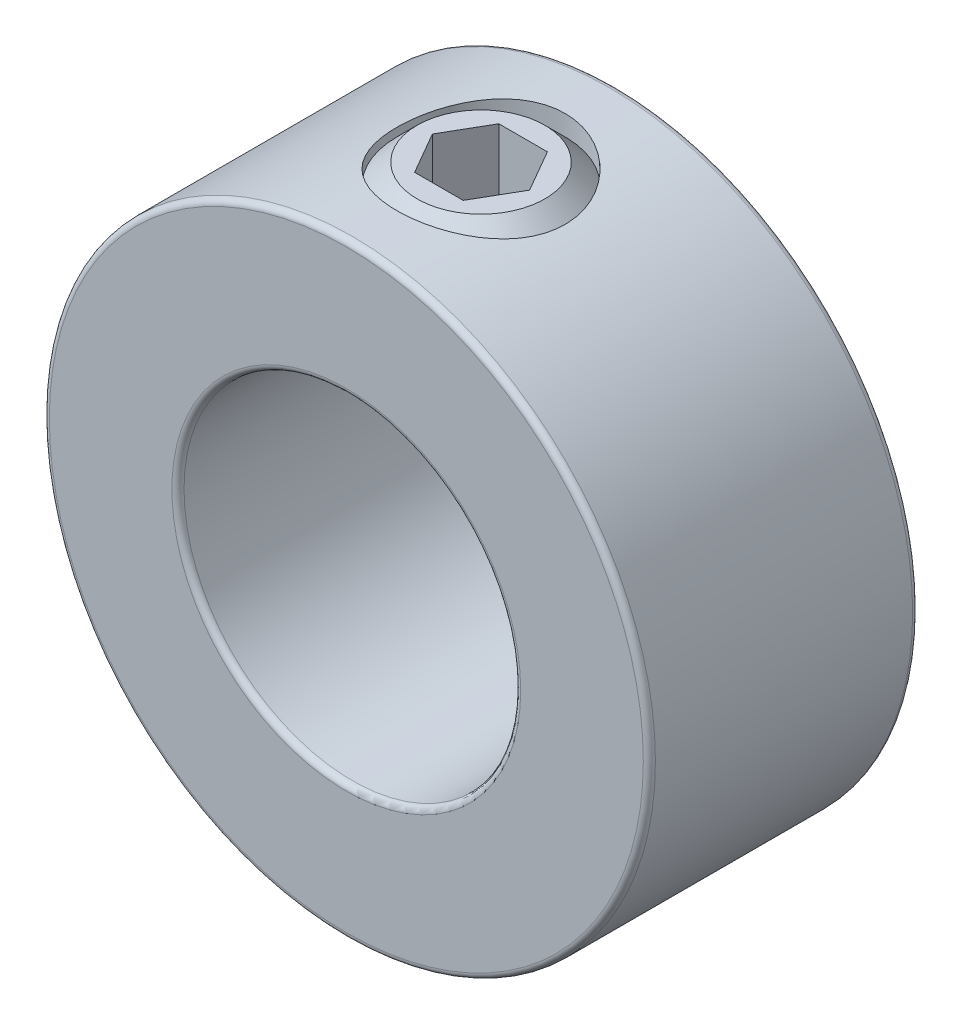
ISO-10303-21;
HEADER;
FILE_DESCRIPTION(('STEP AP214'),'2;1');
FILE_NAME('part.step','',(''),(''),'','','');
FILE_SCHEMA(('AUTOMOTIVE_DESIGN { 1 0 10303 214 1 1 1 1 }'));
ENDSEC;
DATA;
#1=APPLICATION_CONTEXT('core data for automotive mechanical design processes');
#2=APPLICATION_PROTOCOL_DEFINITION('international standard','automotive_design',2000,#1);
#3=PRODUCT_CONTEXT('',#1,'mechanical');
#4=PRODUCT('Part','Part','',(#3));
#5=PRODUCT_RELATED_PRODUCT_CATEGORY('part','',(#4));
#6=PRODUCT_DEFINITION_FORMATION('','',#4);
#7=PRODUCT_DEFINITION_CONTEXT('part definition',#1,'design');
#8=PRODUCT_DEFINITION('design','',#6,#7);
#9=PRODUCT_DEFINITION_SHAPE('','',#8);
#10=(LENGTH_UNIT() NAMED_UNIT(*) SI_UNIT(.MILLI.,.METRE.));
#11=(NAMED_UNIT(*) PLANE_ANGLE_UNIT() SI_UNIT($,.RADIAN.));
#12=(NAMED_UNIT(*) SI_UNIT($,.STERADIAN.) SOLID_ANGLE_UNIT());
#13=UNCERTAINTY_MEASURE_WITH_UNIT(LENGTH_MEASURE(1.E-05),#10,'distance_accuracy_value','');
#14=(GEOMETRIC_REPRESENTATION_CONTEXT(3) GLOBAL_UNCERTAINTY_ASSIGNED_CONTEXT((#13)) GLOBAL_UNIT_ASSIGNED_CONTEXT((#10,
#11,#12)) REPRESENTATION_CONTEXT('',''));
#15=CARTESIAN_POINT('',(0.,0.,0.));
#16=DIRECTION('',(0.,0.,1.));
#17=DIRECTION('',(1.,0.,0.));
#18=AXIS2_PLACEMENT_3D('',#15,#16,#17);
#19=CARTESIAN_POINT('',(0.,14.2875,0.));
#20=DIRECTION('',(0.,1.,0.));
#21=DIRECTION('',(-1.,0.,0.));
#22=AXIS2_PLACEMENT_3D('',#19,#20,#21);
#23=PLANE('',#22);
#24=CARTESIAN_POINT('',(0.,14.2875,0.));
#25=DIRECTION('',(0.,1.,0.));
#26=DIRECTION('',(-1.,0.,0.));
#27=AXIS2_PLACEMENT_3D('',#24,#25,#26);
#28=CIRCLE('',#27,3.01024078905505);
#29=CARTESIAN_POINT('',(-3.01024078905505,14.2875,0.));
#30=VERTEX_POINT('',#29);
#31=EDGE_CURVE('E115',#30,#30,#28,.T.);
#32=ORIENTED_EDGE('',*,*,#31,.T.);
#33=EDGE_LOOP('',(#32));
#34=FACE_BOUND('',#33,.T.);
#35=DIRECTION('',(1.,0.,0.));
#36=VECTOR('',#35,1.);
#37=CARTESIAN_POINT('',(-1.14567944042316,14.2875,-1.984375));
#38=LINE('',#37,#36);
#39=CARTESIAN_POINT('',(-1.14567944042316,14.2875,-1.984375));
#40=VERTEX_POINT('',#39);
#41=CARTESIAN_POINT('',(1.14567944042316,14.2875,-1.984375));
#42=VERTEX_POINT('',#41);
#43=EDGE_CURVE('E110',#40,#42,#38,.T.);
#44=ORIENTED_EDGE('',*,*,#43,.T.);
#45=DIRECTION('',(0.5,0.,0.866025403784439));
#46=VECTOR('',#45,1.);
#47=CARTESIAN_POINT('',(1.14567944042316,14.2875,-1.984375));
#48=LINE('',#47,#46);
#49=CARTESIAN_POINT('',(2.29135888084633,14.2875,0.));
#50=VERTEX_POINT('',#49);
#51=EDGE_CURVE('E56',#42,#50,#48,.T.);
#52=ORIENTED_EDGE('',*,*,#51,.T.);
#53=DIRECTION('',(-0.5,0.,0.866025403784439));
#54=VECTOR('',#53,1.);
#55=CARTESIAN_POINT('',(2.29135888084633,14.2875,0.));
#56=LINE('',#55,#54);
#57=CARTESIAN_POINT('',(1.14567944042317,14.2875,1.984375));
#58=VERTEX_POINT('',#57);
#59=EDGE_CURVE('E114',#50,#58,#56,.T.);
#60=ORIENTED_EDGE('',*,*,#59,.T.);
#61=DIRECTION('',(-1.,0.,0.));
#62=VECTOR('',#61,1.);
#63=CARTESIAN_POINT('',(1.14567944042317,14.2875,1.984375));
#64=LINE('',#63,#62);
#65=CARTESIAN_POINT('',(-1.14567944042316,14.2875,1.984375));
#66=VERTEX_POINT('',#65);
#67=EDGE_CURVE('E272',#58,#66,#64,.T.);
#68=ORIENTED_EDGE('',*,*,#67,.T.);
#69=DIRECTION('',(-0.5,0.,-0.866025403784439));
#70=VECTOR('',#69,1.);
#71=CARTESIAN_POINT('',(-1.14567944042316,14.2875,1.984375));
#72=LINE('',#71,#70);
#73=CARTESIAN_POINT('',(-2.29135888084633,14.2875,0.));
#74=VERTEX_POINT('',#73);
#75=EDGE_CURVE('E269',#66,#74,#72,.T.);
#76=ORIENTED_EDGE('',*,*,#75,.T.);
#77=DIRECTION('',(0.5,0.,-0.866025403784439));
#78=VECTOR('',#77,1.);
#79=CARTESIAN_POINT('',(-2.29135888084633,14.2875,0.));
#80=LINE('',#79,#78);
#81=EDGE_CURVE('E263',#74,#40,#80,.T.);
#82=ORIENTED_EDGE('',*,*,#81,.T.);
#83=EDGE_LOOP('',(#44,#52,#60,#68,#76,#82));
#84=FACE_BOUND('',#83,.T.);
#85=ADVANCED_FACE('F41',(#34,#84),#23,.T.);
#86=CARTESIAN_POINT('',(0.,7.9375,0.));
#87=DIRECTION('',(0.,-1.,0.));
#88=DIRECTION('',(1.,0.,0.));
#89=AXIS2_PLACEMENT_3D('',#86,#87,#88);
#90=CONICAL_SURFACE('',#89,1.15021105313395,0.785398163397449);
#91=CARTESIAN_POINT('',(0.,9.08771105313395,0.));
#92=VERTEX_POINT('',#91);
#93=VERTEX_LOOP('',#92);
#94=FACE_BOUND('',#93,.T.);
#95=CARTESIAN_POINT('',(0.,7.9375,0.));
#96=DIRECTION('',(0.,1.,0.));
#97=DIRECTION('',(-1.,0.,0.));
#98=AXIS2_PLACEMENT_3D('',#95,#96,#97);
#99=CIRCLE('',#98,1.15021105313395);
#100=CARTESIAN_POINT('',(-1.15021105313395,7.9375,0.));
#101=VERTEX_POINT('',#100);
#102=EDGE_CURVE('E12',#101,#101,#99,.T.);
#103=ORIENTED_EDGE('',*,*,#102,.F.);
#104=EDGE_LOOP('',(#103));
#105=FACE_BOUND('',#104,.T.);
#106=ADVANCED_FACE('F43',(#94,#105),#90,.F.);
#107=CARTESIAN_POINT('',(-3.01024078905505,7.9375,0.));
#108=DIRECTION('',(0.,-1.,0.));
#109=DIRECTION('',(1.,0.,0.));
#110=AXIS2_PLACEMENT_3D('',#107,#108,#109);
#111=PLANE('',#110);
#112=ORIENTED_EDGE('',*,*,#102,.T.);
#113=EDGE_LOOP('',(#112));
#114=FACE_BOUND('',#113,.T.);
#115=CARTESIAN_POINT('',(0.,7.9375,0.));
#116=DIRECTION('',(0.,1.,0.));
#117=DIRECTION('',(-1.,0.,0.));
#118=AXIS2_PLACEMENT_3D('',#115,#116,#117);
#119=CIRCLE('',#118,3.01024078905505);
#120=CARTESIAN_POINT('',(-3.01024078905505,7.9375,0.));
#121=VERTEX_POINT('',#120);
#122=EDGE_CURVE('E49',#121,#121,#119,.T.);
#123=ORIENTED_EDGE('',*,*,#122,.F.);
#124=EDGE_LOOP('',(#123));
#125=FACE_BOUND('',#124,.T.);
#126=ADVANCED_FACE('F135',(#114,#125),#111,.T.);
#127=CARTESIAN_POINT('',(0.,8.89600921094495,0.));
#128=DIRECTION('',(0.,1.,0.));
#129=DIRECTION('',(-1.,0.,0.));
#130=AXIS2_PLACEMENT_3D('',#127,#128,#129);
#131=CONICAL_SURFACE('',#130,3.96875,0.785398163397449);
#132=ORIENTED_EDGE('',*,*,#122,.T.);
#133=EDGE_LOOP('',(#132));
#134=FACE_BOUND('',#133,.T.);
#135=CARTESIAN_POINT('',(0.,8.89600921094495,0.));
#136=DIRECTION('',(0.,1.,0.));
#137=DIRECTION('',(-1.,0.,0.));
#138=AXIS2_PLACEMENT_3D('',#135,#136,#137);
#139=CIRCLE('',#138,3.96875);
#140=CARTESIAN_POINT('',(-3.96875,8.89600921094495,0.));
#141=VERTEX_POINT('',#140);
#142=EDGE_CURVE('E127',#141,#141,#139,.T.);
#143=ORIENTED_EDGE('',*,*,#142,.F.);
#144=EDGE_LOOP('',(#143));
#145=FACE_BOUND('',#144,.T.);
#146=ADVANCED_FACE('F132',(#134,#145),#131,.T.);
#147=CARTESIAN_POINT('',(0.,7.9375,0.));
#148=DIRECTION('',(0.,1.,0.));
#149=DIRECTION('',(-1.,0.,0.));
#150=AXIS2_PLACEMENT_3D('',#147,#148,#149);
#151=CYLINDRICAL_SURFACE('',#150,3.96875);
#152=ORIENTED_EDGE('',*,*,#142,.T.);
#153=EDGE_LOOP('',(#152));
#154=FACE_BOUND('',#153,.T.);
#155=CARTESIAN_POINT('',(0.,13.328990789055,0.));
#156=DIRECTION('',(0.,1.,0.));
#157=DIRECTION('',(-1.,0.,0.));
#158=AXIS2_PLACEMENT_3D('',#155,#156,#157);
#159=CIRCLE('',#158,3.96875);
#160=CARTESIAN_POINT('',(-3.96875,13.328990789055,0.));
#161=VERTEX_POINT('',#160);
#162=EDGE_CURVE('E119',#161,#161,#159,.T.);
#163=ORIENTED_EDGE('',*,*,#162,.F.);
#164=EDGE_LOOP('',(#163));
#165=FACE_BOUND('',#164,.T.);
#166=ADVANCED_FACE('F142',(#154,#165),#151,.T.);
#167=CARTESIAN_POINT('',(0.,14.2875,0.));
#168=DIRECTION('',(0.,-1.,0.));
#169=DIRECTION('',(1.,0.,0.));
#170=AXIS2_PLACEMENT_3D('',#167,#168,#169);
#171=CONICAL_SURFACE('',#170,3.01024078905505,0.785398163397448);
#172=ORIENTED_EDGE('',*,*,#162,.T.);
#173=EDGE_LOOP('',(#172));
#174=FACE_BOUND('',#173,.T.);
#175=ORIENTED_EDGE('',*,*,#31,.F.);
#176=EDGE_LOOP('',(#175));
#177=FACE_BOUND('',#176,.T.);
#178=ADVANCED_FACE('F153',(#174,#177),#171,.T.);
#179=CARTESIAN_POINT('',(1.14567944042316,10.31875,-1.984375));
#180=DIRECTION('',(-0.866025403784439,0.,0.5));
#181=DIRECTION('',(0.5,0.,0.866025403784439));
#182=AXIS2_PLACEMENT_3D('',#179,#180,#181);
#183=PLANE('',#182);
#184=ORIENTED_EDGE('',*,*,#51,.F.);
#185=DIRECTION('',(0.,1.,0.));
#186=VECTOR('',#185,1.);
#187=CARTESIAN_POINT('',(1.14567944042316,10.31875,-1.984375));
#188=LINE('',#187,#186);
#189=CARTESIAN_POINT('',(1.14567944042316,10.31875,-1.984375));
#190=VERTEX_POINT('',#189);
#191=EDGE_CURVE('E109',#190,#42,#188,.T.);
#192=ORIENTED_EDGE('',*,*,#191,.F.);
#193=DIRECTION('',(0.5,0.,0.866025403784439));
#194=VECTOR('',#193,1.);
#195=CARTESIAN_POINT('',(1.14567944042316,10.31875,-1.984375));
#196=LINE('',#195,#194);
#197=CARTESIAN_POINT('',(2.29135888084633,10.31875,0.));
#198=VERTEX_POINT('',#197);
#199=EDGE_CURVE('E100',#190,#198,#196,.T.);
#200=ORIENTED_EDGE('',*,*,#199,.T.);
#201=DIRECTION('',(0.,1.,0.));
#202=VECTOR('',#201,1.);
#203=CARTESIAN_POINT('',(2.29135888084633,10.31875,0.));
#204=LINE('',#203,#202);
#205=EDGE_CURVE('E108',#198,#50,#204,.T.);
#206=ORIENTED_EDGE('',*,*,#205,.T.);
#207=EDGE_LOOP('',(#184,#192,#200,#206));
#208=FACE_BOUND('',#207,.T.);
#209=ADVANCED_FACE('F107',(#208),#183,.T.);
#210=CARTESIAN_POINT('',(2.29135888084633,10.31875,0.));
#211=DIRECTION('',(-0.866025403784439,0.,-0.5));
#212=DIRECTION('',(-0.5,0.,0.866025403784439));
#213=AXIS2_PLACEMENT_3D('',#210,#211,#212);
#214=PLANE('',#213);
#215=ORIENTED_EDGE('',*,*,#59,.F.);
#216=ORIENTED_EDGE('',*,*,#205,.F.);
#217=DIRECTION('',(-0.5,0.,0.866025403784439));
#218=VECTOR('',#217,1.);
#219=CARTESIAN_POINT('',(2.29135888084633,10.31875,0.));
#220=LINE('',#219,#218);
#221=CARTESIAN_POINT('',(1.14567944042317,10.31875,1.984375));
#222=VERTEX_POINT('',#221);
#223=EDGE_CURVE('E96',#198,#222,#220,.T.);
#224=ORIENTED_EDGE('',*,*,#223,.T.);
#225=DIRECTION('',(0.,1.,0.));
#226=VECTOR('',#225,1.);
#227=CARTESIAN_POINT('',(1.14567944042317,10.31875,1.984375));
#228=LINE('',#227,#226);
#229=EDGE_CURVE('E116',#222,#58,#228,.T.);
#230=ORIENTED_EDGE('',*,*,#229,.T.);
#231=EDGE_LOOP('',(#215,#216,#224,#230));
#232=FACE_BOUND('',#231,.T.);
#233=ADVANCED_FACE('F112',(#232),#214,.T.);
#234=CARTESIAN_POINT('',(1.14567944042317,10.31875,1.984375));
#235=DIRECTION('',(0.,0.,-1.));
#236=DIRECTION('',(-1.,0.,0.));
#237=AXIS2_PLACEMENT_3D('',#234,#235,#236);
#238=PLANE('',#237);
#239=ORIENTED_EDGE('',*,*,#67,.F.);
#240=ORIENTED_EDGE('',*,*,#229,.F.);
#241=DIRECTION('',(-1.,0.,0.));
#242=VECTOR('',#241,1.);
#243=CARTESIAN_POINT('',(1.14567944042317,10.31875,1.984375));
#244=LINE('',#243,#242);
#245=CARTESIAN_POINT('',(-1.14567944042316,10.31875,1.984375));
#246=VERTEX_POINT('',#245);
#247=EDGE_CURVE('E102',#222,#246,#244,.T.);
#248=ORIENTED_EDGE('',*,*,#247,.T.);
#249=DIRECTION('',(0.,1.,0.));
#250=VECTOR('',#249,1.);
#251=CARTESIAN_POINT('',(-1.14567944042316,10.31875,1.984375));
#252=LINE('',#251,#250);
#253=EDGE_CURVE('E121',#246,#66,#252,.T.);
#254=ORIENTED_EDGE('',*,*,#253,.T.);
#255=EDGE_LOOP('',(#239,#240,#248,#254));
#256=FACE_BOUND('',#255,.T.);
#257=ADVANCED_FACE('F183',(#256),#238,.T.);
#258=CARTESIAN_POINT('',(-1.14567944042316,10.31875,1.984375));
#259=DIRECTION('',(0.866025403784439,0.,-0.5));
#260=DIRECTION('',(-0.5,0.,-0.866025403784439));
#261=AXIS2_PLACEMENT_3D('',#258,#259,#260);
#262=PLANE('',#261);
#263=ORIENTED_EDGE('',*,*,#75,.F.);
#264=ORIENTED_EDGE('',*,*,#253,.F.);
#265=DIRECTION('',(-0.5,0.,-0.866025403784439));
#266=VECTOR('',#265,1.);
#267=CARTESIAN_POINT('',(-1.14567944042316,10.31875,1.984375));
#268=LINE('',#267,#266);
#269=CARTESIAN_POINT('',(-2.29135888084633,10.31875,0.));
#270=VERTEX_POINT('',#269);
#271=EDGE_CURVE('E288',#246,#270,#268,.T.);
#272=ORIENTED_EDGE('',*,*,#271,.T.);
#273=DIRECTION('',(0.,1.,0.));
#274=VECTOR('',#273,1.);
#275=CARTESIAN_POINT('',(-2.29135888084633,10.31875,0.));
#276=LINE('',#275,#274);
#277=EDGE_CURVE('E279',#270,#74,#276,.T.);
#278=ORIENTED_EDGE('',*,*,#277,.T.);
#279=EDGE_LOOP('',(#263,#264,#272,#278));
#280=FACE_BOUND('',#279,.T.);
#281=ADVANCED_FACE('F189',(#280),#262,.T.);
#282=CARTESIAN_POINT('',(-2.29135888084633,10.31875,0.));
#283=DIRECTION('',(0.866025403784439,0.,0.5));
#284=DIRECTION('',(0.5,0.,-0.866025403784439));
#285=AXIS2_PLACEMENT_3D('',#282,#283,#284);
#286=PLANE('',#285);
#287=ORIENTED_EDGE('',*,*,#81,.F.);
#288=ORIENTED_EDGE('',*,*,#277,.F.);
#289=DIRECTION('',(0.5,0.,-0.866025403784439));
#290=VECTOR('',#289,1.);
#291=CARTESIAN_POINT('',(-2.29135888084633,10.31875,0.));
#292=LINE('',#291,#290);
#293=CARTESIAN_POINT('',(-1.14567944042316,10.31875,-1.984375));
#294=VERTEX_POINT('',#293);
#295=EDGE_CURVE('E286',#270,#294,#292,.T.);
#296=ORIENTED_EDGE('',*,*,#295,.T.);
#297=DIRECTION('',(0.,1.,0.));
#298=VECTOR('',#297,1.);
#299=CARTESIAN_POINT('',(-1.14567944042316,10.31875,-1.984375));
#300=LINE('',#299,#298);
#301=EDGE_CURVE('E262',#294,#40,#300,.T.);
#302=ORIENTED_EDGE('',*,*,#301,.T.);
#303=EDGE_LOOP('',(#287,#288,#296,#302));
#304=FACE_BOUND('',#303,.T.);
#305=ADVANCED_FACE('F197',(#304),#286,.T.);
#306=CARTESIAN_POINT('',(-1.14567944042316,10.31875,-1.984375));
#307=DIRECTION('',(0.,0.,1.));
#308=DIRECTION('',(1.,0.,0.));
#309=AXIS2_PLACEMENT_3D('',#306,#307,#308);
#310=PLANE('',#309);
#311=ORIENTED_EDGE('',*,*,#43,.F.);
#312=ORIENTED_EDGE('',*,*,#301,.F.);
#313=DIRECTION('',(1.,0.,0.));
#314=VECTOR('',#313,1.);
#315=CARTESIAN_POINT('',(-1.14567944042316,10.31875,-1.984375));
#316=LINE('',#315,#314);
#317=EDGE_CURVE('E277',#294,#190,#316,.T.);
#318=ORIENTED_EDGE('',*,*,#317,.T.);
#319=ORIENTED_EDGE('',*,*,#191,.T.);
#320=EDGE_LOOP('',(#311,#312,#318,#319));
#321=FACE_BOUND('',#320,.T.);
#322=ADVANCED_FACE('F205',(#321),#310,.T.);
#323=CARTESIAN_POINT('',(3.43703832126949,10.31875,1.984375));
#324=DIRECTION('',(0.,-1.,0.));
#325=DIRECTION('',(0.,0.,-1.));
#326=AXIS2_PLACEMENT_3D('',#323,#324,#325);
#327=PLANE('',#326);
#328=ORIENTED_EDGE('',*,*,#199,.F.);
#329=ORIENTED_EDGE('',*,*,#317,.F.);
#330=ORIENTED_EDGE('',*,*,#295,.F.);
#331=ORIENTED_EDGE('',*,*,#271,.F.);
#332=ORIENTED_EDGE('',*,*,#247,.F.);
#333=ORIENTED_EDGE('',*,*,#223,.F.);
#334=EDGE_LOOP('',(#328,#329,#330,#331,#332,#333));
#335=FACE_BOUND('',#334,.T.);
#336=ADVANCED_FACE('F98',(#335),#327,.F.);
#337=CLOSED_SHELL('',(#85,#106,#126,#146,#166,#178,#209,#233,#257,#281,#305,#322,#336));
#338=MANIFOLD_SOLID_BREP('B2',#337);
#339=CARTESIAN_POINT('',(0.,0.,6.35));
#340=DIRECTION('',(0.,0.,1.));
#341=DIRECTION('',(1.,0.,0.));
#342=AXIS2_PLACEMENT_3D('',#339,#340,#341);
#343=PLANE('',#342);
#344=CARTESIAN_POINT('',(0.,0.,6.35));
#345=DIRECTION('',(0.,0.,1.));
#346=DIRECTION('',(1.,0.,0.));
#347=AXIS2_PLACEMENT_3D('',#344,#345,#346);
#348=CIRCLE('',#347,8.22325);
#349=CARTESIAN_POINT('',(8.22325,0.,6.35));
#350=VERTEX_POINT('',#349);
#351=EDGE_CURVE('E307',#350,#350,#348,.F.);
#352=ORIENTED_EDGE('',*,*,#351,.T.);
#353=EDGE_LOOP('',(#352));
#354=FACE_BOUND('',#353,.T.);
#355=CARTESIAN_POINT('',(0.,0.,6.35));
#356=DIRECTION('',(0.,0.,1.));
#357=DIRECTION('',(1.,0.,0.));
#358=AXIS2_PLACEMENT_3D('',#355,#356,#357);
#359=CIRCLE('',#358,14.00175);
#360=CARTESIAN_POINT('',(14.00175,0.,6.35));
#361=VERTEX_POINT('',#360);
#362=EDGE_CURVE('E311',#361,#361,#359,.T.);
#363=ORIENTED_EDGE('',*,*,#362,.T.);
#364=EDGE_LOOP('',(#363));
#365=FACE_BOUND('',#364,.T.);
#366=ADVANCED_FACE('F296',(#354,#365),#343,.T.);
#367=CARTESIAN_POINT('',(0.,0.,-6.35));
#368=DIRECTION('',(0.,0.,1.));
#369=DIRECTION('',(1.,0.,0.));
#370=AXIS2_PLACEMENT_3D('',#367,#368,#369);
#371=PLANE('',#370);
#372=CARTESIAN_POINT('',(0.,0.,-6.35));
#373=DIRECTION('',(0.,0.,1.));
#374=DIRECTION('',(1.,0.,0.));
#375=AXIS2_PLACEMENT_3D('',#372,#373,#374);
#376=CIRCLE('',#375,8.22325);
#377=CARTESIAN_POINT('',(8.22325,0.,-6.35));
#378=VERTEX_POINT('',#377);
#379=EDGE_CURVE('E322',#378,#378,#376,.T.);
#380=ORIENTED_EDGE('',*,*,#379,.T.);
#381=EDGE_LOOP('',(#380));
#382=FACE_BOUND('',#381,.T.);
#383=CARTESIAN_POINT('',(0.,0.,-6.35));
#384=DIRECTION('',(0.,0.,1.));
#385=DIRECTION('',(1.,0.,0.));
#386=AXIS2_PLACEMENT_3D('',#383,#384,#385);
#387=CIRCLE('',#386,14.00175);
#388=CARTESIAN_POINT('',(14.00175,0.,-6.35));
#389=VERTEX_POINT('',#388);
#390=EDGE_CURVE('E325',#389,#389,#387,.F.);
#391=ORIENTED_EDGE('',*,*,#390,.T.);
#392=EDGE_LOOP('',(#391));
#393=FACE_BOUND('',#392,.T.);
#394=ADVANCED_FACE('F359',(#382,#393),#371,.F.);
#395=CARTESIAN_POINT('',(0.,0.,6.35));
#396=DIRECTION('',(0.,0.,-1.));
#397=DIRECTION('',(-1.,0.,0.));
#398=AXIS2_PLACEMENT_3D('',#395,#396,#397);
#399=CYLINDRICAL_SURFACE('',#398,14.2875);
#400=CARTESIAN_POINT('',(0.,0.,-6.06425));
#401=DIRECTION('',(0.,0.,1.));
#402=DIRECTION('',(1.,0.,0.));
#403=AXIS2_PLACEMENT_3D('',#400,#401,#402);
#404=CIRCLE('',#403,14.2875);
#405=CARTESIAN_POINT('',(14.2875,0.,-6.06425));
#406=VERTEX_POINT('',#405);
#407=EDGE_CURVE('E40',#406,#406,#404,.T.);
#408=ORIENTED_EDGE('',*,*,#407,.T.);
#409=EDGE_LOOP('',(#408));
#410=FACE_BOUND('',#409,.T.);
#411=CARTESIAN_POINT('',(0.,0.,6.06425));
#412=DIRECTION('',(0.,0.,1.));
#413=DIRECTION('',(1.,0.,0.));
#414=AXIS2_PLACEMENT_3D('',#411,#412,#413);
#415=CIRCLE('',#414,14.2875);
#416=CARTESIAN_POINT('',(14.2875,0.,6.06425));
#417=VERTEX_POINT('',#416);
#418=EDGE_CURVE('E303',#417,#417,#415,.F.);
#419=ORIENTED_EDGE('',*,*,#418,.T.);
#420=EDGE_LOOP('',(#419));
#421=FACE_BOUND('',#420,.T.);
#422=CARTESIAN_POINT('',(0.,14.2875,-3.96875));
#423=CARTESIAN_POINT('',(0.218443971554094,14.2874970795375,-3.9687455563169));
#424=CARTESIAN_POINT('',(0.436934367914718,14.2824414022569,-3.95065465961819));
#425=CARTESIAN_POINT('',(0.867598836281707,14.2627651687941,-3.87891106275761));
#426=CARTESIAN_POINT('',(1.07977020413142,14.2481405774891,-3.82524336005893));
#427=CARTESIAN_POINT('',(1.49151959023496,14.2109369512781,-3.6842423158608));
#428=CARTESIAN_POINT('',(1.69111418855375,14.188368658732,-3.59695442438257));
#429=CARTESIAN_POINT('',(2.07283270739263,14.1376499244794,-3.39136511741216));
#430=CARTESIAN_POINT('',(2.25495507482906,14.1094989872198,-3.27306094840623));
#431=CARTESIAN_POINT('',(2.60110854147304,14.0498562607013,-3.00567904754905));
#432=CARTESIAN_POINT('',(2.76464113316684,14.0183036125371,-2.85596952399255));
#433=CARTESIAN_POINT('',(3.06463123958594,13.9557952759881,-2.53137582013844));
#434=CARTESIAN_POINT('',(3.20108494543484,13.9248396721348,-2.35648810427424));
#435=CARTESIAN_POINT('',(3.44553567242501,13.8664011562938,-1.98244694909135));
#436=CARTESIAN_POINT('',(3.55294802959285,13.8389946720664,-1.78289836319845));
#437=CARTESIAN_POINT('',(3.73249688891467,13.7916571008822,-1.36768866148537));
#438=CARTESIAN_POINT('',(3.80464051542933,13.7717245043734,-1.15203080992701));
#439=CARTESIAN_POINT('',(3.9098513486844,13.7422217889887,-0.716271145392378));
#440=CARTESIAN_POINT('',(3.94382742170528,13.7324111276617,-0.496405466345519));
#441=CARTESIAN_POINT('',(3.97457380971881,13.7235453650401,-0.0538928134019439));
#442=CARTESIAN_POINT('',(3.97135172286719,13.7244880672456,0.168753583219997));
#443=CARTESIAN_POINT('',(3.92851231497134,13.7368078966957,0.603320734948872));
#444=CARTESIAN_POINT('',(3.89000689709432,13.7478662264285,0.815361594751626));
#445=CARTESIAN_POINT('',(3.77947971565998,13.7786591662469,1.22984777077717));
#446=CARTESIAN_POINT('',(3.70745507101462,13.7983945221434,1.43229226051185));
#447=CARTESIAN_POINT('',(3.53105634701941,13.8445897154349,1.82467958487083));
#448=CARTESIAN_POINT('',(3.42630194332451,13.871127915571,2.01444182712201));
#449=CARTESIAN_POINT('',(3.18768224157839,13.9278979342118,2.37407950250212));
#450=CARTESIAN_POINT('',(3.05381077797265,13.958130534413,2.54395071195546));
#451=CARTESIAN_POINT('',(2.75512406265311,14.0201990400309,2.86532282038565));
#452=CARTESIAN_POINT('',(2.58937848805498,14.052053748701,3.01595674074354));
#453=CARTESIAN_POINT('',(2.23458597786329,14.1128178439927,3.28747669521954));
#454=CARTESIAN_POINT('',(2.04553796321474,14.1417270941071,3.40836135097537));
#455=CARTESIAN_POINT('',(1.64808988814852,14.1935466608803,3.61737851462549));
#456=CARTESIAN_POINT('',(1.4395970564991,14.2164259944957,3.70534280500603));
#457=CARTESIAN_POINT('',(1.00999921434385,14.2533843869208,3.84471576255134));
#458=CARTESIAN_POINT('',(0.78889721608459,14.2674655380275,3.8961331213471));
#459=CARTESIAN_POINT('',(0.347746979489227,14.2849198833482,3.95956515927325));
#460=CARTESIAN_POINT('',(0.127880446101315,14.2886129589129,3.97275731008026));
#461=CARTESIAN_POINT('',(-0.310927529771102,14.2858007493079,3.96263178042154));
#462=CARTESIAN_POINT('',(-0.52986907387835,14.2792966152821,3.93931822101743));
#463=CARTESIAN_POINT('',(-0.956331950269976,14.2570284156239,3.85780491417017));
#464=CARTESIAN_POINT('',(-1.16399083992026,14.2414414550698,3.80027197444243));
#465=CARTESIAN_POINT('',(-1.56668190002696,14.2027855761279,3.652736320249));
#466=CARTESIAN_POINT('',(-1.76171264361239,14.1797158140119,3.56272994409161));
#467=CARTESIAN_POINT('',(-2.13810894578712,14.1279162540193,3.35068583720259));
#468=CARTESIAN_POINT('',(-2.31910592170221,14.0990787150506,3.22802083527632));
#469=CARTESIAN_POINT('',(-2.65835660411401,14.0390713988331,2.95492126881052));
#470=CARTESIAN_POINT('',(-2.81660541145569,14.007901121386,2.80448073828826));
#471=CARTESIAN_POINT('',(-3.11090318554911,13.9455475051814,2.47459041568929));
#472=CARTESIAN_POINT('',(-3.24611866285671,13.9143933104224,2.29439009131624));
#473=CARTESIAN_POINT('',(-3.4844222103752,13.8566427625908,1.91318947472034));
#474=CARTESIAN_POINT('',(-3.58751150933388,13.8300462352162,1.71218997840674));
#475=CARTESIAN_POINT('',(-3.75786986022478,13.784732366187,1.29601223564908));
#476=CARTESIAN_POINT('',(-3.82533771009336,13.7659714208028,1.08092037525792));
#477=CARTESIAN_POINT('',(-3.9229554666793,13.738475089142,0.641827172744165));
#478=CARTESIAN_POINT('',(-3.95311591602425,13.7297368706127,0.417828366094963));
#479=CARTESIAN_POINT('',(-3.9746193041937,13.7235259670579,-0.0241483499340404));
#480=CARTESIAN_POINT('',(-3.96730762970401,13.7256628079239,-0.242056253359612));
#481=CARTESIAN_POINT('',(-3.91722429935622,13.740039099373,-0.673401287848073));
#482=CARTESIAN_POINT('',(-3.87445370806734,13.7522782466583,-0.88683855293396));
#483=CARTESIAN_POINT('',(-3.75547649489872,13.7852378226909,-1.30132846766945));
#484=CARTESIAN_POINT('',(-3.67957781485687,13.8058800246405,-1.50247617540115));
#485=CARTESIAN_POINT('',(-3.49673709054442,13.8533160845087,-1.88933906646621));
#486=CARTESIAN_POINT('',(-3.38978980913797,13.8801109800759,-2.07505163946854));
#487=CARTESIAN_POINT('',(-3.14390710441698,13.9378947424762,-2.43213779771838));
#488=CARTESIAN_POINT('',(-3.0040646177995,13.9689896826976,-2.60286968846723));
#489=CARTESIAN_POINT('',(-2.69805634965575,14.0313039131114,-2.91888028127014));
#490=CARTESIAN_POINT('',(-2.53188405111948,14.0625232322194,-3.06415266292899));
#491=CARTESIAN_POINT('',(-2.17316123757756,14.1224584067172,-3.32853708363529));
#492=CARTESIAN_POINT('',(-1.98007687210966,14.1510969578719,-3.44694390401138));
#493=CARTESIAN_POINT('',(-1.57594929504977,14.2017742030934,-3.64943434224411));
#494=CARTESIAN_POINT('',(-1.3649167208111,14.2238167718717,-3.73353812149474));
#495=CARTESIAN_POINT('',(-0.962486910959275,14.2562603759146,-3.85514875633266));
#496=CARTESIAN_POINT('',(-0.772681976885754,14.2678862997639,-3.89764520060737));
#497=CARTESIAN_POINT('',(-0.388596586576574,14.283506960497,-3.95444613548657));
#498=CARTESIAN_POINT('',(-0.194316661211643,14.2875025978951,-3.96875395287477));
#499=CARTESIAN_POINT('',(0.,14.2875,-3.96875));
#500=B_SPLINE_CURVE_WITH_KNOTS('',3,(#422,#423,#424,#425,#426,#427,#428,#429,#430,#431,#432,
#433,#434,#435,#436,#437,#438,#439,#440,#441,#442,#443,#444,#445,#446,#447,#448,#449,#450,#451,
#452,#453,#454,#455,#456,#457,#458,#459,#460,#461,#462,#463,#464,#465,#466,#467,#468,#469,#470,
#471,#472,#473,#474,#475,#476,#477,#478,#479,#480,#481,#482,#483,#484,#485,#486,#487,#488,#489,
#490,#491,#492,#493,#494,#495,#496,#497,#498,#499),.UNSPECIFIED.,.T.,.F.,(4,2,2,2,2,2,2,2,2,2,2,
2,2,2,2,2,2,2,2,2,2,2,2,2,2,2,2,2,2,2,2,2,2,2,2,2,2,2,4),(0.,0.654618938090882,1.30951410101755,
1.96352702271856,2.61759802501043,3.28636707232713,3.95523012114685,4.63669666777658,
5.31802549973495,5.98276146413783,6.6473616509106,7.2917123975849,7.93611853856212,
8.58831023142982,9.24064016095644,9.91614392950064,10.5916789900351,11.2706202590804,
11.9494000075017,12.6070363363216,13.2645984311532,13.9097485800492,14.5549714985655,
15.2136141272132,15.8723983924696,16.5514652367045,17.2305061051044,17.9057161843002,
18.5807354135371,19.2316925262891,19.8826300963172,20.5276416207276,21.1727620060019,
21.838345746766,22.5040944872385,23.1856943763891,23.8668930802509,24.4492775724935,
25.0315933283862),.UNSPECIFIED.);
#501=CARTESIAN_POINT('',(0.,14.2875,-3.96875));
#502=VERTEX_POINT('',#501);
#503=EDGE_CURVE('E328',#502,#502,#500,.T.);
#504=ORIENTED_EDGE('',*,*,#503,.T.);
#505=EDGE_LOOP('',(#504));
#506=FACE_BOUND('',#505,.T.);
#507=ADVANCED_FACE('F355',(#410,#421,#506),#399,.T.);
#508=CARTESIAN_POINT('',(0.,0.,6.35));
#509=DIRECTION('',(0.,0.,-1.));
#510=DIRECTION('',(-1.,0.,0.));
#511=AXIS2_PLACEMENT_3D('',#508,#509,#510);
#512=CYLINDRICAL_SURFACE('',#511,7.9375);
#513=CARTESIAN_POINT('',(0.,0.,-6.06425));
#514=DIRECTION('',(0.,0.,1.));
#515=DIRECTION('',(1.,0.,0.));
#516=AXIS2_PLACEMENT_3D('',#513,#514,#515);
#517=CIRCLE('',#516,7.9375);
#518=CARTESIAN_POINT('',(7.9375,0.,-6.06425));
#519=VERTEX_POINT('',#518);
#520=EDGE_CURVE('E316',#519,#519,#517,.F.);
#521=ORIENTED_EDGE('',*,*,#520,.T.);
#522=EDGE_LOOP('',(#521));
#523=FACE_BOUND('',#522,.T.);
#524=CARTESIAN_POINT('',(0.,0.,6.06425));
#525=DIRECTION('',(0.,0.,1.));
#526=DIRECTION('',(1.,0.,0.));
#527=AXIS2_PLACEMENT_3D('',#524,#525,#526);
#528=CIRCLE('',#527,7.9375);
#529=CARTESIAN_POINT('',(7.9375,0.,6.06425));
#530=VERTEX_POINT('',#529);
#531=EDGE_CURVE('E319',#530,#530,#528,.T.);
#532=ORIENTED_EDGE('',*,*,#531,.T.);
#533=EDGE_LOOP('',(#532));
#534=FACE_BOUND('',#533,.T.);
#535=CARTESIAN_POINT('',(0.,7.9375,-3.96875));
#536=CARTESIAN_POINT('',(0.104369410089828,7.93749964710061,-3.96874959831509));
#537=CARTESIAN_POINT('',(0.208746323529612,7.93543652404866,-3.96462799938244));
#538=CARTESIAN_POINT('',(0.416729911813044,7.9272367842324,-3.94818981313592));
#539=CARTESIAN_POINT('',(0.520336231742605,7.92109839537058,-3.93586966073959));
#540=CARTESIAN_POINT('',(0.726110731039584,7.90489272677887,-3.90315299713828));
#541=CARTESIAN_POINT('',(0.82827664337823,7.89481984439238,-3.88274496831698));
#542=CARTESIAN_POINT('',(1.03030258640491,7.87100738632354,-3.8340930831276));
#543=CARTESIAN_POINT('',(1.13016165631416,7.8572663117564,-3.80584602341294));
#544=CARTESIAN_POINT('',(1.42440199017918,7.81115458867984,-3.71003886443782));
#545=CARTESIAN_POINT('',(1.61448373622076,7.77380867280489,-3.63124454244051));
#546=CARTESIAN_POINT('',(1.9783439584702,7.68928332519479,-3.44657259204585));
#547=CARTESIAN_POINT('',(2.15212371864541,7.64210466884467,-3.34069709905159));
#548=CARTESIAN_POINT('',(2.49041365625515,7.53888923529746,-3.0975400978896));
#549=CARTESIAN_POINT('',(2.65372701475933,7.48248923455529,-2.95874609843218));
#550=CARTESIAN_POINT('',(2.95584177494966,7.36838155110921,-2.65700357442673));
#551=CARTESIAN_POINT('',(3.09462449787671,7.31067290934779,-2.49403681579299));
#552=CARTESIAN_POINT('',(3.3546096064078,7.19529548141556,-2.13322397370708));
#553=CARTESIAN_POINT('',(3.47361399641898,7.13797684614345,-1.93365308091488));
#554=CARTESIAN_POINT('',(3.62524200471708,7.06149696460579,-1.61931494863912));
#555=CARTESIAN_POINT('',(3.6713159275105,7.03758021096291,-1.51199982674657));
#556=CARTESIAN_POINT('',(3.7540313686651,6.99380755132026,-1.29301778650766));
#557=CARTESIAN_POINT('',(3.7906784717335,6.973949242426,-1.18135349009291));
#558=CARTESIAN_POINT('',(3.85217834905982,6.94015758970911,-0.961236985532085));
#559=CARTESIAN_POINT('',(3.8776017912118,6.92594266308114,-0.852987146610149));
#560=CARTESIAN_POINT('',(3.91931981478622,6.90242088712119,-0.634265262514365));
#561=CARTESIAN_POINT('',(3.93561923963159,6.89311143390609,-0.523794428667328));
#562=CARTESIAN_POINT('',(3.95884711357792,6.87979769947166,-0.301618954139092));
#563=CARTESIAN_POINT('',(3.96578120630086,6.87579022326954,-0.189915097443525));
#564=CARTESIAN_POINT('',(3.97018212403133,6.87325014427843,0.0337348493040591));
#565=CARTESIAN_POINT('',(3.96764985229861,6.87471701913886,0.145680915226328));
#566=CARTESIAN_POINT('',(3.95403164408641,6.882557023164,0.355366219239711));
#567=CARTESIAN_POINT('',(3.94400811209084,6.88832056579457,0.453198943950519));
#568=CARTESIAN_POINT('',(3.91679667622581,6.90382839940707,0.647552771446266));
#569=CARTESIAN_POINT('',(3.89960652217992,6.913573940638,0.744073452438309));
#570=CARTESIAN_POINT('',(3.83755551593145,6.94833703678735,1.03066367092444));
#571=CARTESIAN_POINT('',(3.78220441315265,6.97888716992628,1.21790564882277));
#572=CARTESIAN_POINT('',(3.64414196450859,7.05197183776459,1.58447018954603));
#573=CARTESIAN_POINT('',(3.56082334971471,7.09476894900454,1.76350669585326));
#574=CARTESIAN_POINT('',(3.36963314536098,7.18754170992462,2.10594791992884));
#575=CARTESIAN_POINT('',(3.26175052720868,7.23752058029641,2.26934556931442));
#576=CARTESIAN_POINT('',(3.00858289843046,7.34667673244783,2.59762910919129));
#577=CARTESIAN_POINT('',(2.86028985758812,7.40621681108501,2.76007668343725));
#578=CARTESIAN_POINT('',(2.53820246112426,7.52267817944741,3.05887398457471));
#579=CARTESIAN_POINT('',(2.36439598770338,7.57959820779118,3.19521123886145));
#580=CARTESIAN_POINT('',(2.08304281490361,7.65996142001121,3.3801377721657));
#581=CARTESIAN_POINT('',(1.98335106121144,7.68643989980452,3.439598308505));
#582=CARTESIAN_POINT('',(1.77856405970501,7.73638797457795,3.54981517816121));
#583=CARTESIAN_POINT('',(1.67347111414213,7.7598588368905,3.60057518072294));
#584=CARTESIAN_POINT('',(1.4586172453551,7.80309870748913,3.69284162922927));
#585=CARTESIAN_POINT('',(1.34885822252742,7.82286920546371,3.7343518002487));
#586=CARTESIAN_POINT('',(1.12546755793707,7.85811727288069,3.80763853278187));
#587=CARTESIAN_POINT('',(1.01183636334388,7.87359533615191,3.83941621402666));
#588=CARTESIAN_POINT('',(0.791208415491778,7.89868242604485,3.89059226310625));
#589=CARTESIAN_POINT('',(0.684441602894769,7.90867135755798,3.91079791270498));
#590=CARTESIAN_POINT('',(0.469303417873443,7.9243478563447,3.94240389786561));
#591=CARTESIAN_POINT('',(0.360932188154227,7.93003580385413,3.95380501180943));
#592=CARTESIAN_POINT('',(0.143518381405852,7.93694735700268,3.96764913973557));
#593=CARTESIAN_POINT('',(0.0344760774196133,7.93817267176881,3.97009558323543));
#594=CARTESIAN_POINT('',(-0.183393594918013,7.93612884272146,3.9660073535314));
#595=CARTESIAN_POINT('',(-0.292220972568114,7.9328598978143,3.95947307779495));
#596=CARTESIAN_POINT('',(-0.500320083529767,7.92234666698602,3.93836567710977));
#597=CARTESIAN_POINT('',(-0.599676397866459,7.91543153005083,3.92445768924795));
#598=CARTESIAN_POINT('',(-0.796761893609951,7.8980306181852,3.88923966595847));
#599=CARTESIAN_POINT('',(-0.894490510702847,7.88754363087236,3.8679271171737));
#600=CARTESIAN_POINT('',(-1.18419302276536,7.85107181593958,3.79319713244382));
#601=CARTESIAN_POINT('',(-1.37287107818242,7.82006600845009,3.72896790738271));
#602=CARTESIAN_POINT('',(-1.74186943050378,7.74637387784252,3.57187687632019));
#603=CARTESIAN_POINT('',(-1.92179650921422,7.70337892840573,3.47824890418095));
#604=CARTESIAN_POINT('',(-2.26401140510817,7.60983879747084,3.26585358319541));
#605=CARTESIAN_POINT('',(-2.42629166335538,7.55929040232656,3.14707552512338));
#606=CARTESIAN_POINT('',(-2.74545105225973,7.44967204864139,2.87433432654422));
#607=CARTESIAN_POINT('',(-2.90023484753893,7.39025272428329,2.71806140443821));
#608=CARTESIAN_POINT('',(-3.18238412157331,7.27321792607378,2.38151236884886));
#609=CARTESIAN_POINT('',(-3.30973063302717,7.21560372346056,2.20121978911255));
#610=CARTESIAN_POINT('',(-3.48032517112611,7.13410756555508,1.91095906381558));
#611=CARTESIAN_POINT('',(-3.53478285096047,7.10720459960474,1.80827783342651));
#612=CARTESIAN_POINT('',(-3.63472626965577,7.05661423482835,1.59789967745941));
#613=CARTESIAN_POINT('',(-3.68021633321873,7.03292528774382,1.49020520068685));
#614=CARTESIAN_POINT('',(-3.76169238454404,6.98968572556066,1.27057383624013));
#615=CARTESIAN_POINT('',(-3.79768600142671,6.97013179105681,1.15864043715617));
#616=CARTESIAN_POINT('',(-3.85972848253965,6.93596861212021,0.931314029593095));
#617=CARTESIAN_POINT('',(-3.88577888656024,6.92135860211885,0.815921559767693));
#618=CARTESIAN_POINT('',(-3.92552100991457,6.89888830107334,0.593911399127248));
#619=CARTESIAN_POINT('',(-3.94015890862892,6.89051477606184,0.487514470473713));
#620=CARTESIAN_POINT('',(-3.96076406455219,6.87869148958232,0.273617858472804));
#621=CARTESIAN_POINT('',(-3.96673223020604,6.87524121223989,0.166118291852619));
#622=CARTESIAN_POINT('',(-3.96990399660637,6.873410736258,-0.0490215006621673));
#623=CARTESIAN_POINT('',(-3.96711067808675,6.87502875549179,-0.156661663815282));
#624=CARTESIAN_POINT('',(-3.95282195577091,6.88325209939153,-0.371138794401708));
#625=CARTESIAN_POINT('',(-3.94132690821957,6.88985721988777,-0.477975794535321));
#626=CARTESIAN_POINT('',(-3.89701731529281,6.91507935211119,-0.775692323470657));
#627=CARTESIAN_POINT('',(-3.85448259337964,6.93908910453775,-0.964769258975417));
#628=CARTESIAN_POINT('',(-3.74322760725249,6.99972091146971,-1.33277421737704));
#629=CARTESIAN_POINT('',(-3.67449891980817,7.03634702267056,-1.51169895433122));
#630=CARTESIAN_POINT('',(-3.50764414414008,7.12107082894389,-1.86778161168967));
#631=CARTESIAN_POINT('',(-3.4078532129875,7.16977392107559,-2.04401318376358));
#632=CARTESIAN_POINT('',(-3.18353453279148,7.2721522858031,-2.37837461907173));
#633=CARTESIAN_POINT('',(-3.05899391421101,7.32583013743155,-2.53649499698964));
#634=CARTESIAN_POINT('',(-2.77100358220972,7.4399095177021,-2.85012101131163));
#635=CARTESIAN_POINT('',(-2.60466485397247,7.50033552370546,-3.00297446142354));
#636=CARTESIAN_POINT('',(-2.24689081707859,7.61515429445718,-3.27924757575967));
#637=CARTESIAN_POINT('',(-2.0554420667032,7.66954379879204,-3.40265137473236));
#638=CARTESIAN_POINT('',(-1.75223394986301,7.74238841685192,-3.56285030996663));
#639=CARTESIAN_POINT('',(-1.64802750917782,7.76528966617126,-3.61225072233554));
#640=CARTESIAN_POINT('',(-1.43509626570137,7.80744204084633,-3.70199934585301));
#641=CARTESIAN_POINT('',(-1.32637371391815,7.82669495867774,-3.74235200408321));
#642=CARTESIAN_POINT('',(-1.10545166494248,7.86093871740178,-3.81344918549312));
#643=CARTESIAN_POINT('',(-0.993260348832235,7.87593884757798,-3.844214664579));
#644=CARTESIAN_POINT('',(-0.766157034396537,7.90126228219691,-3.89583422001635));
#645=CARTESIAN_POINT('',(-0.65124674319286,7.91158844330997,-3.91669435077413));
#646=CARTESIAN_POINT('',(-0.446914305999841,7.92540632621577,-3.94452040540807));
#647=CARTESIAN_POINT('',(-0.357842962446189,7.92993350293085,-3.9535986908231));
#648=CARTESIAN_POINT('',(-0.179182931830079,7.9359805327966,-3.96571374390637));
#649=CARTESIAN_POINT('',(-0.0895942305566303,7.93750030294076,-3.96875034481991));
#650=CARTESIAN_POINT('',(0.,7.9375,-3.96875));
#651=B_SPLINE_CURVE_WITH_KNOTS('',3,(#535,#536,#537,#538,#539,#540,#541,#542,#543,#544,#545,
#546,#547,#548,#549,#550,#551,#552,#553,#554,#555,#556,#557,#558,#559,#560,#561,#562,#563,#564,
#565,#566,#567,#568,#569,#570,#571,#572,#573,#574,#575,#576,#577,#578,#579,#580,#581,#582,#583,
#584,#585,#586,#587,#588,#589,#590,#591,#592,#593,#594,#595,#596,#597,#598,#599,#600,#601,#602,
#603,#604,#605,#606,#607,#608,#609,#610,#611,#612,#613,#614,#615,#616,#617,#618,#619,#620,#621,
#622,#623,#624,#625,#626,#627,#628,#629,#630,#631,#632,#633,#634,#635,#636,#637,#638,#639,#640,
#641,#642,#643,#644,#645,#646,#647,#648,#649,#650),.UNSPECIFIED.,.T.,.F.,(4,2,2,2,2,2,2,2,2,2,2,
2,2,2,2,2,2,2,2,2,2,2,2,2,2,2,2,2,2,2,2,2,2,2,2,2,2,2,2,2,2,2,2,2,2,2,2,2,2,2,2,2,2,2,2,2,2,4),
(0.,0.31301951512835,0.626175233580017,0.939778516116712,1.25351013887969,1.87785009933137,
2.50214084452941,3.16419977463372,3.82676067541076,4.54070318744181,4.89791582095781,
5.25491634195222,5.5907403388691,5.92638589641845,6.26182910096519,6.5972402990738,
6.89242045929009,7.18769337007426,7.7778104396881,8.38167306557458,8.98580734640279,
9.66654401807604,10.3476050632731,10.7043834335805,11.0610109688386,11.4174946231157,
11.773937248231,12.1008595463039,12.4277529388723,12.7545211225897,13.0812748447114,
13.382601220787,13.6840299772615,14.2863280775274,14.905847348907,15.5256309518745,
16.2062779227394,16.8873939234647,17.2448954524989,17.6022241496149,17.959264900909,
18.3162503389791,18.6389736088749,18.9616630602592,19.2842390595328,19.6068018534042,
20.1898457717763,20.7730773388125,21.3954935434924,22.0182342479126,22.7166422369348,
23.4154256304279,23.7677430677371,24.1198869552545,24.4712556289908,24.8224092597297,
25.0911083791427,25.3598149147358),.UNSPECIFIED.);
#652=CARTESIAN_POINT('',(0.,7.9375,-3.96875));
#653=VERTEX_POINT('',#652);
#654=EDGE_CURVE('E329',#653,#653,#651,.T.);
#655=ORIENTED_EDGE('',*,*,#654,.F.);
#656=EDGE_LOOP('',(#655));
#657=FACE_BOUND('',#656,.T.);
#658=ADVANCED_FACE('F339',(#523,#534,#657),#512,.F.);
#659=CARTESIAN_POINT('',(0.,14.2875,0.));
#660=DIRECTION('',(0.,-1.,0.));
#661=DIRECTION('',(0.,0.,-1.));
#662=AXIS2_PLACEMENT_3D('',#659,#660,#661);
#663=CYLINDRICAL_SURFACE('',#662,3.96875);
#664=ORIENTED_EDGE('',*,*,#654,.T.);
#665=EDGE_LOOP('',(#664));
#666=FACE_BOUND('',#665,.T.);
#667=ORIENTED_EDGE('',*,*,#503,.F.);
#668=EDGE_LOOP('',(#667));
#669=FACE_BOUND('',#668,.T.);
#670=ADVANCED_FACE('F342',(#666,#669),#663,.F.);
#671=CARTESIAN_POINT('',(0.,0.,-6.06425));
#672=DIRECTION('',(0.,0.,1.));
#673=DIRECTION('',(1.,0.,0.));
#674=AXIS2_PLACEMENT_3D('',#671,#672,#673);
#675=TOROIDAL_SURFACE('',#674,8.22325,0.28575);
#676=ORIENTED_EDGE('',*,*,#520,.F.);
#677=EDGE_LOOP('',(#676));
#678=FACE_BOUND('',#677,.T.);
#679=ORIENTED_EDGE('',*,*,#379,.F.);
#680=EDGE_LOOP('',(#679));
#681=FACE_BOUND('',#680,.T.);
#682=ADVANCED_FACE('F345',(#678,#681),#675,.T.);
#683=CARTESIAN_POINT('',(0.,0.,6.06425));
#684=DIRECTION('',(0.,0.,1.));
#685=DIRECTION('',(1.,0.,0.));
#686=AXIS2_PLACEMENT_3D('',#683,#684,#685);
#687=TOROIDAL_SURFACE('',#686,8.22325,0.28575);
#688=ORIENTED_EDGE('',*,*,#351,.F.);
#689=EDGE_LOOP('',(#688));
#690=FACE_BOUND('',#689,.T.);
#691=ORIENTED_EDGE('',*,*,#531,.F.);
#692=EDGE_LOOP('',(#691));
#693=FACE_BOUND('',#692,.T.);
#694=ADVANCED_FACE('F352',(#690,#693),#687,.T.);
#695=CARTESIAN_POINT('',(0.,0.,-6.06425));
#696=DIRECTION('',(0.,0.,1.));
#697=DIRECTION('',(1.,0.,0.));
#698=AXIS2_PLACEMENT_3D('',#695,#696,#697);
#699=TOROIDAL_SURFACE('',#698,14.00175,0.28575);
#700=ORIENTED_EDGE('',*,*,#390,.F.);
#701=EDGE_LOOP('',(#700));
#702=FACE_BOUND('',#701,.T.);
#703=ORIENTED_EDGE('',*,*,#407,.F.);
#704=EDGE_LOOP('',(#703));
#705=FACE_BOUND('',#704,.T.);
#706=ADVANCED_FACE('F371',(#702,#705),#699,.T.);
#707=CARTESIAN_POINT('',(0.,0.,6.06425));
#708=DIRECTION('',(0.,0.,1.));
#709=DIRECTION('',(1.,0.,0.));
#710=AXIS2_PLACEMENT_3D('',#707,#708,#709);
#711=TOROIDAL_SURFACE('',#710,14.00175,0.28575);
#712=ORIENTED_EDGE('',*,*,#418,.F.);
#713=EDGE_LOOP('',(#712));
#714=FACE_BOUND('',#713,.T.);
#715=ORIENTED_EDGE('',*,*,#362,.F.);
#716=EDGE_LOOP('',(#715));
#717=FACE_BOUND('',#716,.T.);
#718=ADVANCED_FACE('F298',(#714,#717),#711,.T.);
#719=CLOSED_SHELL('',(#366,#394,#507,#658,#670,#682,#694,#706,#718));
#720=MANIFOLD_SOLID_BREP('B6',#719);
#721=ADVANCED_BREP_SHAPE_REPRESENTATION('',(#18,#338,#720),#14);
#722=SHAPE_DEFINITION_REPRESENTATION(#9,#721);
ENDSEC;
END-ISO-10303-21;
